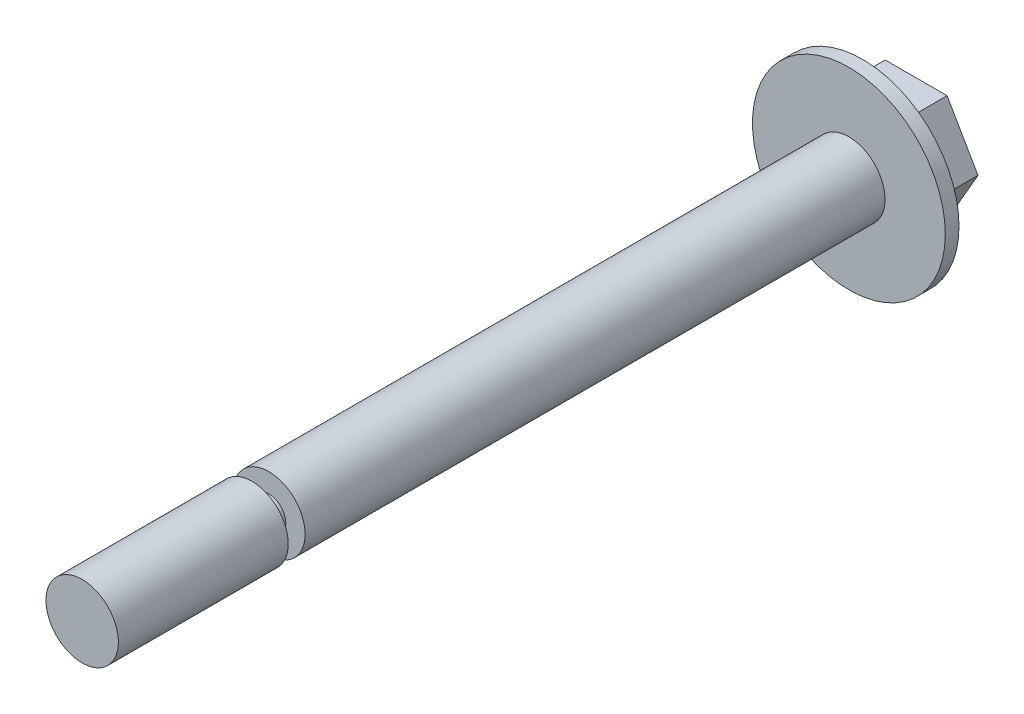
ISO-10303-21;
HEADER;
FILE_DESCRIPTION(('STEP AP214'),'2;1');
FILE_NAME('part.step','',(''),(''),'','','');
FILE_SCHEMA(('AUTOMOTIVE_DESIGN { 1 0 10303 214 1 1 1 1 }'));
ENDSEC;
DATA;
#1=APPLICATION_CONTEXT('core data for automotive mechanical design processes');
#2=APPLICATION_PROTOCOL_DEFINITION('international standard','automotive_design',2000,#1);
#3=PRODUCT_CONTEXT('',#1,'mechanical');
#4=PRODUCT('Part','Part','',(#3));
#5=PRODUCT_RELATED_PRODUCT_CATEGORY('part','',(#4));
#6=PRODUCT_DEFINITION_FORMATION('','',#4);
#7=PRODUCT_DEFINITION_CONTEXT('part definition',#1,'design');
#8=PRODUCT_DEFINITION('design','',#6,#7);
#9=PRODUCT_DEFINITION_SHAPE('','',#8);
#10=(LENGTH_UNIT() NAMED_UNIT(*) SI_UNIT(.MILLI.,.METRE.));
#11=(NAMED_UNIT(*) PLANE_ANGLE_UNIT() SI_UNIT($,.RADIAN.));
#12=(NAMED_UNIT(*) SI_UNIT($,.STERADIAN.) SOLID_ANGLE_UNIT());
#13=UNCERTAINTY_MEASURE_WITH_UNIT(LENGTH_MEASURE(1.E-05),#10,'distance_accuracy_value','');
#14=(GEOMETRIC_REPRESENTATION_CONTEXT(3) GLOBAL_UNCERTAINTY_ASSIGNED_CONTEXT((#13)) GLOBAL_UNIT_ASSIGNED_CONTEXT((#10,
#11,#12)) REPRESENTATION_CONTEXT('',''));
#15=CARTESIAN_POINT('',(0.,0.,0.));
#16=DIRECTION('',(0.,0.,1.));
#17=DIRECTION('',(1.,0.,0.));
#18=AXIS2_PLACEMENT_3D('',#15,#16,#17);
#19=CARTESIAN_POINT('',(1.8330871046771,-3.17499999999998,3.175));
#20=DIRECTION('',(-0.866025403784441,0.499999999999995,0.));
#21=DIRECTION('',(-0.499999999999995,-0.866025403784441,0.));
#22=AXIS2_PLACEMENT_3D('',#19,#20,#21);
#23=PLANE('',#22);
#24=DIRECTION('',(0.499999999999995,0.866025403784441,0.));
#25=VECTOR('',#24,1.);
#26=CARTESIAN_POINT('',(1.8330871046771,-3.17499999999998,0.));
#27=LINE('',#26,#25);
#28=CARTESIAN_POINT('',(1.8330871046771,-3.17499999999998,0.));
#29=VERTEX_POINT('',#28);
#30=CARTESIAN_POINT('',(3.66617420935413,0.,0.));
#31=VERTEX_POINT('',#30);
#32=EDGE_CURVE('E143',#29,#31,#27,.T.);
#33=ORIENTED_EDGE('',*,*,#32,.T.);
#34=DIRECTION('',(0.,0.,-1.));
#35=VECTOR('',#34,1.);
#36=CARTESIAN_POINT('',(3.66617420935413,0.,3.175));
#37=LINE('',#36,#35);
#38=CARTESIAN_POINT('',(3.66617420935413,0.,3.175));
#39=VERTEX_POINT('',#38);
#40=EDGE_CURVE('E11',#39,#31,#37,.T.);
#41=ORIENTED_EDGE('',*,*,#40,.F.);
#42=DIRECTION('',(0.499999999999995,0.866025403784441,0.));
#43=VECTOR('',#42,1.);
#44=CARTESIAN_POINT('',(1.8330871046771,-3.17499999999998,3.175));
#45=LINE('',#44,#43);
#46=CARTESIAN_POINT('',(1.8330871046771,-3.17499999999998,3.175));
#47=VERTEX_POINT('',#46);
#48=EDGE_CURVE('E133',#47,#39,#45,.T.);
#49=ORIENTED_EDGE('',*,*,#48,.F.);
#50=DIRECTION('',(0.,0.,-1.));
#51=VECTOR('',#50,1.);
#52=CARTESIAN_POINT('',(1.8330871046771,-3.17499999999998,3.175));
#53=LINE('',#52,#51);
#54=EDGE_CURVE('E142',#47,#29,#53,.T.);
#55=ORIENTED_EDGE('',*,*,#54,.T.);
#56=EDGE_LOOP('',(#33,#41,#49,#55));
#57=FACE_BOUND('',#56,.T.);
#58=ADVANCED_FACE('F45',(#57),#23,.F.);
#59=CARTESIAN_POINT('',(3.66617420935413,0.,3.175));
#60=DIRECTION('',(-0.866025403784438,-0.500000000000001,0.));
#61=DIRECTION('',(0.500000000000001,-0.866025403784438,0.));
#62=AXIS2_PLACEMENT_3D('',#59,#60,#61);
#63=PLANE('',#62);
#64=DIRECTION('',(-0.500000000000001,0.866025403784438,0.));
#65=VECTOR('',#64,1.);
#66=CARTESIAN_POINT('',(3.66617420935413,0.,0.));
#67=LINE('',#66,#65);
#68=CARTESIAN_POINT('',(1.83308710467706,3.17500000000001,0.));
#69=VERTEX_POINT('',#68);
#70=EDGE_CURVE('E147',#31,#69,#67,.T.);
#71=ORIENTED_EDGE('',*,*,#70,.T.);
#72=DIRECTION('',(0.,0.,-1.));
#73=VECTOR('',#72,1.);
#74=CARTESIAN_POINT('',(1.83308710467706,3.17500000000001,3.175));
#75=LINE('',#74,#73);
#76=CARTESIAN_POINT('',(1.83308710467706,3.17500000000001,3.175));
#77=VERTEX_POINT('',#76);
#78=EDGE_CURVE('E54',#77,#69,#75,.T.);
#79=ORIENTED_EDGE('',*,*,#78,.F.);
#80=DIRECTION('',(-0.500000000000001,0.866025403784438,0.));
#81=VECTOR('',#80,1.);
#82=CARTESIAN_POINT('',(3.66617420935413,0.,3.175));
#83=LINE('',#82,#81);
#84=EDGE_CURVE('E98',#39,#77,#83,.T.);
#85=ORIENTED_EDGE('',*,*,#84,.F.);
#86=ORIENTED_EDGE('',*,*,#40,.T.);
#87=EDGE_LOOP('',(#71,#79,#85,#86));
#88=FACE_BOUND('',#87,.T.);
#89=ADVANCED_FACE('F219',(#88),#63,.F.);
#90=CARTESIAN_POINT('',(1.83308710467706,3.17500000000001,3.175));
#91=DIRECTION('',(0.,-1.,0.));
#92=DIRECTION('',(1.,0.,0.));
#93=AXIS2_PLACEMENT_3D('',#90,#91,#92);
#94=PLANE('',#93);
#95=DIRECTION('',(-1.,0.,0.));
#96=VECTOR('',#95,1.);
#97=CARTESIAN_POINT('',(1.83308710467706,3.17500000000001,0.));
#98=LINE('',#97,#96);
#99=CARTESIAN_POINT('',(-1.83308710467708,3.17499999999999,0.));
#100=VERTEX_POINT('',#99);
#101=EDGE_CURVE('E113',#69,#100,#98,.T.);
#102=ORIENTED_EDGE('',*,*,#101,.T.);
#103=DIRECTION('',(0.,0.,-1.));
#104=VECTOR('',#103,1.);
#105=CARTESIAN_POINT('',(-1.83308710467708,3.17499999999999,3.175));
#106=LINE('',#105,#104);
#107=CARTESIAN_POINT('',(-1.83308710467708,3.17499999999999,3.175));
#108=VERTEX_POINT('',#107);
#109=EDGE_CURVE('E106',#108,#100,#106,.T.);
#110=ORIENTED_EDGE('',*,*,#109,.F.);
#111=DIRECTION('',(-1.,0.,0.));
#112=VECTOR('',#111,1.);
#113=CARTESIAN_POINT('',(1.83308710467706,3.17500000000001,3.175));
#114=LINE('',#113,#112);
#115=EDGE_CURVE('E111',#77,#108,#114,.T.);
#116=ORIENTED_EDGE('',*,*,#115,.F.);
#117=ORIENTED_EDGE('',*,*,#78,.T.);
#118=EDGE_LOOP('',(#102,#110,#116,#117));
#119=FACE_BOUND('',#118,.T.);
#120=ADVANCED_FACE('F108',(#119),#94,.F.);
#121=CARTESIAN_POINT('',(-1.83308710467708,3.17499999999999,3.175));
#122=DIRECTION('',(0.866025403784441,-0.499999999999995,0.));
#123=DIRECTION('',(0.499999999999995,0.866025403784442,0.));
#124=AXIS2_PLACEMENT_3D('',#121,#122,#123);
#125=PLANE('',#124);
#126=DIRECTION('',(-0.499999999999995,-0.866025403784441,0.));
#127=VECTOR('',#126,1.);
#128=CARTESIAN_POINT('',(-1.83308710467708,3.17499999999999,0.));
#129=LINE('',#128,#127);
#130=CARTESIAN_POINT('',(-3.66617420935413,0.,0.));
#131=VERTEX_POINT('',#130);
#132=EDGE_CURVE('E153',#100,#131,#129,.T.);
#133=ORIENTED_EDGE('',*,*,#132,.T.);
#134=DIRECTION('',(0.,0.,-1.));
#135=VECTOR('',#134,1.);
#136=CARTESIAN_POINT('',(-3.66617420935413,0.,3.175));
#137=LINE('',#136,#135);
#138=CARTESIAN_POINT('',(-3.66617420935413,0.,3.175));
#139=VERTEX_POINT('',#138);
#140=EDGE_CURVE('E117',#139,#131,#137,.T.);
#141=ORIENTED_EDGE('',*,*,#140,.F.);
#142=DIRECTION('',(-0.499999999999995,-0.866025403784441,0.));
#143=VECTOR('',#142,1.);
#144=CARTESIAN_POINT('',(-1.83308710467708,3.17499999999999,3.175));
#145=LINE('',#144,#143);
#146=EDGE_CURVE('E120',#108,#139,#145,.T.);
#147=ORIENTED_EDGE('',*,*,#146,.F.);
#148=ORIENTED_EDGE('',*,*,#109,.T.);
#149=EDGE_LOOP('',(#133,#141,#147,#148));
#150=FACE_BOUND('',#149,.T.);
#151=ADVANCED_FACE('F121',(#150),#125,.F.);
#152=CARTESIAN_POINT('',(-3.66617420935413,0.,3.175));
#153=DIRECTION('',(0.866025403784435,0.500000000000007,0.));
#154=DIRECTION('',(-0.500000000000007,0.866025403784435,0.));
#155=AXIS2_PLACEMENT_3D('',#152,#153,#154);
#156=PLANE('',#155);
#157=DIRECTION('',(0.500000000000007,-0.866025403784435,0.));
#158=VECTOR('',#157,1.);
#159=CARTESIAN_POINT('',(-3.66617420935413,0.,0.));
#160=LINE('',#159,#158);
#161=CARTESIAN_POINT('',(-1.83308710467703,-3.17500000000002,0.));
#162=VERTEX_POINT('',#161);
#163=EDGE_CURVE('E84',#131,#162,#160,.T.);
#164=ORIENTED_EDGE('',*,*,#163,.T.);
#165=DIRECTION('',(0.,0.,-1.));
#166=VECTOR('',#165,1.);
#167=CARTESIAN_POINT('',(-1.83308710467703,-3.17500000000002,3.175));
#168=LINE('',#167,#166);
#169=CARTESIAN_POINT('',(-1.83308710467703,-3.17500000000002,3.175));
#170=VERTEX_POINT('',#169);
#171=EDGE_CURVE('E62',#170,#162,#168,.T.);
#172=ORIENTED_EDGE('',*,*,#171,.F.);
#173=DIRECTION('',(0.500000000000007,-0.866025403784435,0.));
#174=VECTOR('',#173,1.);
#175=CARTESIAN_POINT('',(-3.66617420935413,0.,3.175));
#176=LINE('',#175,#174);
#177=EDGE_CURVE('E125',#139,#170,#176,.T.);
#178=ORIENTED_EDGE('',*,*,#177,.F.);
#179=ORIENTED_EDGE('',*,*,#140,.T.);
#180=EDGE_LOOP('',(#164,#172,#178,#179));
#181=FACE_BOUND('',#180,.T.);
#182=ADVANCED_FACE('F169',(#181),#156,.F.);
#183=CARTESIAN_POINT('',(-1.83308710467703,-3.17500000000002,3.175));
#184=DIRECTION('',(0.,1.,0.));
#185=DIRECTION('',(-1.,0.,0.));
#186=AXIS2_PLACEMENT_3D('',#183,#184,#185);
#187=PLANE('',#186);
#188=DIRECTION('',(1.,0.,0.));
#189=VECTOR('',#188,1.);
#190=CARTESIAN_POINT('',(-1.83308710467703,-3.17500000000002,0.));
#191=LINE('',#190,#189);
#192=EDGE_CURVE('E90',#162,#29,#191,.T.);
#193=ORIENTED_EDGE('',*,*,#192,.T.);
#194=ORIENTED_EDGE('',*,*,#54,.F.);
#195=DIRECTION('',(1.,0.,0.));
#196=VECTOR('',#195,1.);
#197=CARTESIAN_POINT('',(-1.83308710467703,-3.17500000000002,3.175));
#198=LINE('',#197,#196);
#199=EDGE_CURVE('E139',#170,#47,#198,.T.);
#200=ORIENTED_EDGE('',*,*,#199,.F.);
#201=ORIENTED_EDGE('',*,*,#171,.T.);
#202=EDGE_LOOP('',(#193,#194,#200,#201));
#203=FACE_BOUND('',#202,.T.);
#204=ADVANCED_FACE('F171',(#203),#187,.F.);
#205=CARTESIAN_POINT('',(0.,0.,0.));
#206=DIRECTION('',(0.,0.,1.));
#207=DIRECTION('',(1.,0.,0.));
#208=AXIS2_PLACEMENT_3D('',#205,#206,#207);
#209=PLANE('',#208);
#210=ORIENTED_EDGE('',*,*,#32,.F.);
#211=ORIENTED_EDGE('',*,*,#192,.F.);
#212=ORIENTED_EDGE('',*,*,#163,.F.);
#213=ORIENTED_EDGE('',*,*,#132,.F.);
#214=ORIENTED_EDGE('',*,*,#101,.F.);
#215=ORIENTED_EDGE('',*,*,#70,.F.);
#216=EDGE_LOOP('',(#210,#211,#212,#213,#214,#215));
#217=FACE_BOUND('',#216,.T.);
#218=ADVANCED_FACE('F168',(#217),#209,.F.);
#219=CARTESIAN_POINT('',(0.,0.,3.175));
#220=DIRECTION('',(0.,0.,1.));
#221=DIRECTION('',(1.,0.,0.));
#222=AXIS2_PLACEMENT_3D('',#219,#220,#221);
#223=PLANE('',#222);
#224=CARTESIAN_POINT('',(0.,0.,3.175));
#225=DIRECTION('',(0.,0.,1.));
#226=DIRECTION('',(1.,0.,0.));
#227=AXIS2_PLACEMENT_3D('',#224,#225,#226);
#228=CIRCLE('',#227,5.715);
#229=CARTESIAN_POINT('',(5.715,0.,3.175));
#230=VERTEX_POINT('',#229);
#231=EDGE_CURVE('E175',#230,#230,#228,.T.);
#232=ORIENTED_EDGE('',*,*,#231,.F.);
#233=EDGE_LOOP('',(#232));
#234=FACE_BOUND('',#233,.T.);
#235=ORIENTED_EDGE('',*,*,#199,.T.);
#236=ORIENTED_EDGE('',*,*,#48,.T.);
#237=ORIENTED_EDGE('',*,*,#84,.T.);
#238=ORIENTED_EDGE('',*,*,#115,.T.);
#239=ORIENTED_EDGE('',*,*,#146,.T.);
#240=ORIENTED_EDGE('',*,*,#177,.T.);
#241=EDGE_LOOP('',(#235,#236,#237,#238,#239,#240));
#242=FACE_BOUND('',#241,.T.);
#243=ADVANCED_FACE('F128',(#234,#242),#223,.F.);
#244=CARTESIAN_POINT('',(0.,0.,3.9878));
#245=DIRECTION('',(0.,0.,-1.));
#246=DIRECTION('',(-1.,0.,0.));
#247=AXIS2_PLACEMENT_3D('',#244,#245,#246);
#248=CYLINDRICAL_SURFACE('',#247,5.715);
#249=CARTESIAN_POINT('',(0.,0.,3.9878));
#250=DIRECTION('',(0.,0.,1.));
#251=DIRECTION('',(1.,0.,0.));
#252=AXIS2_PLACEMENT_3D('',#249,#250,#251);
#253=CIRCLE('',#252,5.715);
#254=CARTESIAN_POINT('',(5.715,0.,3.9878));
#255=VERTEX_POINT('',#254);
#256=EDGE_CURVE('E148',#255,#255,#253,.T.);
#257=ORIENTED_EDGE('',*,*,#256,.F.);
#258=EDGE_LOOP('',(#257));
#259=FACE_BOUND('',#258,.T.);
#260=ORIENTED_EDGE('',*,*,#231,.T.);
#261=EDGE_LOOP('',(#260));
#262=FACE_BOUND('',#261,.T.);
#263=ADVANCED_FACE('F236',(#259,#262),#248,.T.);
#264=CARTESIAN_POINT('',(0.,0.,3.9878));
#265=DIRECTION('',(0.,0.,1.));
#266=DIRECTION('',(1.,0.,0.));
#267=AXIS2_PLACEMENT_3D('',#264,#265,#266);
#268=PLANE('',#267);
#269=CARTESIAN_POINT('',(0.,0.,3.9878));
#270=DIRECTION('',(0.,0.,-1.));
#271=DIRECTION('',(-1.,0.,0.));
#272=AXIS2_PLACEMENT_3D('',#269,#270,#271);
#273=CIRCLE('',#272,2.145);
#274=CARTESIAN_POINT('',(-2.145,0.,3.9878));
#275=VERTEX_POINT('',#274);
#276=EDGE_CURVE('E179',#275,#275,#273,.T.);
#277=ORIENTED_EDGE('',*,*,#276,.T.);
#278=EDGE_LOOP('',(#277));
#279=FACE_BOUND('',#278,.T.);
#280=ORIENTED_EDGE('',*,*,#256,.T.);
#281=EDGE_LOOP('',(#280));
#282=FACE_BOUND('',#281,.T.);
#283=ADVANCED_FACE('F239',(#279,#282),#268,.T.);
#284=CARTESIAN_POINT('',(0.,0.,3.9878));
#285=DIRECTION('',(0.,0.,-1.));
#286=DIRECTION('',(-1.,0.,0.));
#287=AXIS2_PLACEMENT_3D('',#284,#285,#286);
#288=CYLINDRICAL_SURFACE('',#287,2.145);
#289=CARTESIAN_POINT('',(0.,0.,38.3678));
#290=DIRECTION('',(0.,0.,-1.));
#291=DIRECTION('',(-1.,0.,0.));
#292=AXIS2_PLACEMENT_3D('',#289,#290,#291);
#293=CIRCLE('',#292,2.145);
#294=CARTESIAN_POINT('',(-2.145,0.,38.3678));
#295=VERTEX_POINT('',#294);
#296=EDGE_CURVE('E186',#295,#295,#293,.T.);
#297=ORIENTED_EDGE('',*,*,#296,.T.);
#298=EDGE_LOOP('',(#297));
#299=FACE_BOUND('',#298,.T.);
#300=ORIENTED_EDGE('',*,*,#276,.F.);
#301=EDGE_LOOP('',(#300));
#302=FACE_BOUND('',#301,.T.);
#303=ADVANCED_FACE('F246',(#299,#302),#288,.T.);
#304=CARTESIAN_POINT('',(0.,2.145,38.3678));
#305=DIRECTION('',(0.,0.,1.));
#306=DIRECTION('',(1.,0.,0.));
#307=AXIS2_PLACEMENT_3D('',#304,#305,#306);
#308=PLANE('',#307);
#309=CARTESIAN_POINT('',(0.,0.,38.3678));
#310=DIRECTION('',(0.,0.,-1.));
#311=DIRECTION('',(-1.,0.,0.));
#312=AXIS2_PLACEMENT_3D('',#309,#310,#311);
#313=CIRCLE('',#312,0.999999999999996);
#314=CARTESIAN_POINT('',(-0.999999999999996,0.,38.3678));
#315=VERTEX_POINT('',#314);
#316=EDGE_CURVE('E190',#315,#315,#313,.T.);
#317=ORIENTED_EDGE('',*,*,#316,.T.);
#318=EDGE_LOOP('',(#317));
#319=FACE_BOUND('',#318,.T.);
#320=ORIENTED_EDGE('',*,*,#296,.F.);
#321=EDGE_LOOP('',(#320));
#322=FACE_BOUND('',#321,.T.);
#323=ADVANCED_FACE('F250',(#319,#322),#308,.T.);
#324=CARTESIAN_POINT('',(0.,0.,3.9878));
#325=DIRECTION('',(0.,0.,-1.));
#326=DIRECTION('',(-1.,0.,0.));
#327=AXIS2_PLACEMENT_3D('',#324,#325,#326);
#328=CYLINDRICAL_SURFACE('',#327,0.999999999999996);
#329=CARTESIAN_POINT('',(0.,0.,39.3678));
#330=DIRECTION('',(0.,0.,-1.));
#331=DIRECTION('',(-1.,0.,0.));
#332=AXIS2_PLACEMENT_3D('',#329,#330,#331);
#333=CIRCLE('',#332,0.999999999999996);
#334=CARTESIAN_POINT('',(-0.999999999999996,0.,39.3678));
#335=VERTEX_POINT('',#334);
#336=EDGE_CURVE('E194',#335,#335,#333,.T.);
#337=ORIENTED_EDGE('',*,*,#336,.T.);
#338=EDGE_LOOP('',(#337));
#339=FACE_BOUND('',#338,.T.);
#340=ORIENTED_EDGE('',*,*,#316,.F.);
#341=EDGE_LOOP('',(#340));
#342=FACE_BOUND('',#341,.T.);
#343=ADVANCED_FACE('F254',(#339,#342),#328,.T.);
#344=CARTESIAN_POINT('',(0.,0.999999999999996,39.3678));
#345=DIRECTION('',(0.,0.,-1.));
#346=DIRECTION('',(-1.,0.,0.));
#347=AXIS2_PLACEMENT_3D('',#344,#345,#346);
#348=PLANE('',#347);
#349=CARTESIAN_POINT('',(0.,0.,39.3678));
#350=DIRECTION('',(0.,0.,-1.));
#351=DIRECTION('',(-1.,0.,0.));
#352=AXIS2_PLACEMENT_3D('',#349,#350,#351);
#353=CIRCLE('',#352,2.145);
#354=CARTESIAN_POINT('',(-2.145,0.,39.3678));
#355=VERTEX_POINT('',#354);
#356=EDGE_CURVE('E198',#355,#355,#353,.T.);
#357=ORIENTED_EDGE('',*,*,#356,.T.);
#358=EDGE_LOOP('',(#357));
#359=FACE_BOUND('',#358,.T.);
#360=ORIENTED_EDGE('',*,*,#336,.F.);
#361=EDGE_LOOP('',(#360));
#362=FACE_BOUND('',#361,.T.);
#363=ADVANCED_FACE('F216',(#359,#362),#348,.T.);
#364=CARTESIAN_POINT('',(0.,0.,3.9878));
#365=DIRECTION('',(0.,0.,-1.));
#366=DIRECTION('',(-1.,0.,0.));
#367=AXIS2_PLACEMENT_3D('',#364,#365,#366);
#368=CYLINDRICAL_SURFACE('',#367,2.145);
#369=CARTESIAN_POINT('',(0.,0.,49.4378));
#370=DIRECTION('',(0.,0.,-1.));
#371=DIRECTION('',(-1.,0.,0.));
#372=AXIS2_PLACEMENT_3D('',#369,#370,#371);
#373=CIRCLE('',#372,2.14499999999999);
#374=CARTESIAN_POINT('',(-2.14499999999999,0.,49.4378));
#375=VERTEX_POINT('',#374);
#376=EDGE_CURVE('E202',#375,#375,#373,.T.);
#377=ORIENTED_EDGE('',*,*,#376,.T.);
#378=EDGE_LOOP('',(#377));
#379=FACE_BOUND('',#378,.T.);
#380=ORIENTED_EDGE('',*,*,#356,.F.);
#381=EDGE_LOOP('',(#380));
#382=FACE_BOUND('',#381,.T.);
#383=ADVANCED_FACE('F207',(#379,#382),#368,.T.);
#384=CARTESIAN_POINT('',(0.,2.14499999999999,49.4378));
#385=DIRECTION('',(0.,0.,1.));
#386=DIRECTION('',(1.,0.,0.));
#387=AXIS2_PLACEMENT_3D('',#384,#385,#386);
#388=PLANE('',#387);
#389=ORIENTED_EDGE('',*,*,#376,.F.);
#390=EDGE_LOOP('',(#389));
#391=FACE_BOUND('',#390,.T.);
#392=ADVANCED_FACE('F210',(#391),#388,.T.);
#393=CLOSED_SHELL('',(#58,#89,#120,#151,#182,#204,#218,#243,#263,#283,#303,#323,#343,#363,#383,#392));
#394=MANIFOLD_SOLID_BREP('B2',#393);
#395=ADVANCED_BREP_SHAPE_REPRESENTATION('',(#18,#394),#14);
#396=SHAPE_DEFINITION_REPRESENTATION(#9,#395);
ENDSEC;
END-ISO-10303-21;
